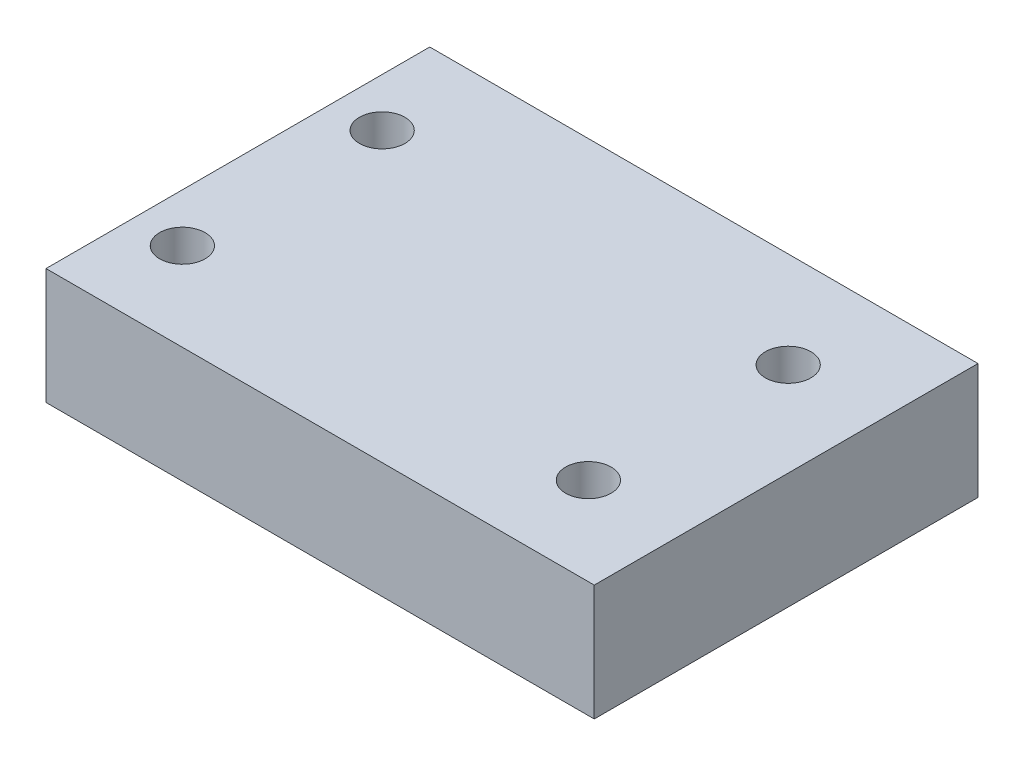
ISO-10303-21;
HEADER;
FILE_DESCRIPTION(('STEP AP214'),'2;1');
FILE_NAME('part.step','',(''),(''),'','','');
FILE_SCHEMA(('AUTOMOTIVE_DESIGN { 1 0 10303 214 1 1 1 1 }'));
ENDSEC;
DATA;
#1=APPLICATION_CONTEXT('core data for automotive mechanical design processes');
#2=APPLICATION_PROTOCOL_DEFINITION('international standard','automotive_design',2000,#1);
#3=PRODUCT_CONTEXT('',#1,'mechanical');
#4=PRODUCT('Part','Part','',(#3));
#5=PRODUCT_RELATED_PRODUCT_CATEGORY('part','',(#4));
#6=PRODUCT_DEFINITION_FORMATION('','',#4);
#7=PRODUCT_DEFINITION_CONTEXT('part definition',#1,'design');
#8=PRODUCT_DEFINITION('design','',#6,#7);
#9=PRODUCT_DEFINITION_SHAPE('','',#8);
#10=(LENGTH_UNIT() NAMED_UNIT(*) SI_UNIT(.MILLI.,.METRE.));
#11=(NAMED_UNIT(*) PLANE_ANGLE_UNIT() SI_UNIT($,.RADIAN.));
#12=(NAMED_UNIT(*) SI_UNIT($,.STERADIAN.) SOLID_ANGLE_UNIT());
#13=UNCERTAINTY_MEASURE_WITH_UNIT(LENGTH_MEASURE(1.E-05),#10,'distance_accuracy_value','');
#14=(GEOMETRIC_REPRESENTATION_CONTEXT(3) GLOBAL_UNCERTAINTY_ASSIGNED_CONTEXT((#13)) GLOBAL_UNIT_ASSIGNED_CONTEXT((#10,
#11,#12)) REPRESENTATION_CONTEXT('',''));
#15=CARTESIAN_POINT('',(0.,0.,0.));
#16=DIRECTION('',(0.,0.,1.));
#17=DIRECTION('',(1.,0.,0.));
#18=AXIS2_PLACEMENT_3D('',#15,#16,#17);
#19=CARTESIAN_POINT('',(30.0101,12.7,-21.0058));
#20=DIRECTION('',(-1.,0.,0.));
#21=DIRECTION('',(0.,0.,1.));
#22=AXIS2_PLACEMENT_3D('',#19,#20,#21);
#23=PLANE('',#22);
#24=DIRECTION('',(0.,0.,-1.));
#25=VECTOR('',#24,1.);
#26=CARTESIAN_POINT('',(30.0101,0.,-21.0058));
#27=LINE('',#26,#25);
#28=CARTESIAN_POINT('',(30.0101,0.,21.0058));
#29=VERTEX_POINT('',#28);
#30=CARTESIAN_POINT('',(30.0101,0.,-21.0058));
#31=VERTEX_POINT('',#30);
#32=EDGE_CURVE('E110',#29,#31,#27,.T.);
#33=ORIENTED_EDGE('',*,*,#32,.T.);
#34=DIRECTION('',(0.,-1.,0.));
#35=VECTOR('',#34,1.);
#36=CARTESIAN_POINT('',(30.0101,12.7,-21.0058));
#37=LINE('',#36,#35);
#38=CARTESIAN_POINT('',(30.0101,12.7,-21.0058));
#39=VERTEX_POINT('',#38);
#40=EDGE_CURVE('E11',#39,#31,#37,.T.);
#41=ORIENTED_EDGE('',*,*,#40,.F.);
#42=DIRECTION('',(0.,0.,-1.));
#43=VECTOR('',#42,1.);
#44=CARTESIAN_POINT('',(30.0101,12.7,-21.0058));
#45=LINE('',#44,#43);
#46=CARTESIAN_POINT('',(30.0101,12.7,21.0058));
#47=VERTEX_POINT('',#46);
#48=EDGE_CURVE('E94',#47,#39,#45,.T.);
#49=ORIENTED_EDGE('',*,*,#48,.F.);
#50=DIRECTION('',(0.,-1.,0.));
#51=VECTOR('',#50,1.);
#52=CARTESIAN_POINT('',(30.0101,12.7,21.0058));
#53=LINE('',#52,#51);
#54=EDGE_CURVE('E106',#47,#29,#53,.T.);
#55=ORIENTED_EDGE('',*,*,#54,.T.);
#56=EDGE_LOOP('',(#33,#41,#49,#55));
#57=FACE_BOUND('',#56,.T.);
#58=ADVANCED_FACE('F42',(#57),#23,.F.);
#59=CARTESIAN_POINT('',(-30.0101,12.7,-21.0058));
#60=DIRECTION('',(0.,0.,1.));
#61=DIRECTION('',(1.,0.,0.));
#62=AXIS2_PLACEMENT_3D('',#59,#60,#61);
#63=PLANE('',#62);
#64=DIRECTION('',(-1.,0.,0.));
#65=VECTOR('',#64,1.);
#66=CARTESIAN_POINT('',(-30.0101,0.,-21.0058));
#67=LINE('',#66,#65);
#68=CARTESIAN_POINT('',(-30.0101,0.,-21.0058));
#69=VERTEX_POINT('',#68);
#70=EDGE_CURVE('E99',#31,#69,#67,.T.);
#71=ORIENTED_EDGE('',*,*,#70,.T.);
#72=DIRECTION('',(0.,-1.,0.));
#73=VECTOR('',#72,1.);
#74=CARTESIAN_POINT('',(-30.0101,12.7,-21.0058));
#75=LINE('',#74,#73);
#76=CARTESIAN_POINT('',(-30.0101,12.7,-21.0058));
#77=VERTEX_POINT('',#76);
#78=EDGE_CURVE('E51',#77,#69,#75,.T.);
#79=ORIENTED_EDGE('',*,*,#78,.F.);
#80=DIRECTION('',(-1.,0.,0.));
#81=VECTOR('',#80,1.);
#82=CARTESIAN_POINT('',(-30.0101,12.7,-21.0058));
#83=LINE('',#82,#81);
#84=EDGE_CURVE('E89',#39,#77,#83,.T.);
#85=ORIENTED_EDGE('',*,*,#84,.F.);
#86=ORIENTED_EDGE('',*,*,#40,.T.);
#87=EDGE_LOOP('',(#71,#79,#85,#86));
#88=FACE_BOUND('',#87,.T.);
#89=ADVANCED_FACE('F98',(#88),#63,.F.);
#90=CARTESIAN_POINT('',(-30.0101,12.7,-21.0058));
#91=DIRECTION('',(1.,0.,0.));
#92=DIRECTION('',(0.,0.,-1.));
#93=AXIS2_PLACEMENT_3D('',#90,#91,#92);
#94=PLANE('',#93);
#95=DIRECTION('',(0.,0.,1.));
#96=VECTOR('',#95,1.);
#97=CARTESIAN_POINT('',(-30.0101,0.,-21.0058));
#98=LINE('',#97,#96);
#99=CARTESIAN_POINT('',(-30.0101,0.,21.0058));
#100=VERTEX_POINT('',#99);
#101=EDGE_CURVE('E76',#69,#100,#98,.T.);
#102=ORIENTED_EDGE('',*,*,#101,.T.);
#103=DIRECTION('',(0.,-1.,0.));
#104=VECTOR('',#103,1.);
#105=CARTESIAN_POINT('',(-30.0101,12.7,21.0058));
#106=LINE('',#105,#104);
#107=CARTESIAN_POINT('',(-30.0101,12.7,21.0058));
#108=VERTEX_POINT('',#107);
#109=EDGE_CURVE('E101',#108,#100,#106,.T.);
#110=ORIENTED_EDGE('',*,*,#109,.F.);
#111=DIRECTION('',(0.,0.,1.));
#112=VECTOR('',#111,1.);
#113=CARTESIAN_POINT('',(-30.0101,12.7,-21.0058));
#114=LINE('',#113,#112);
#115=EDGE_CURVE('E92',#77,#108,#114,.T.);
#116=ORIENTED_EDGE('',*,*,#115,.F.);
#117=ORIENTED_EDGE('',*,*,#78,.T.);
#118=EDGE_LOOP('',(#102,#110,#116,#117));
#119=FACE_BOUND('',#118,.T.);
#120=ADVANCED_FACE('F102',(#119),#94,.F.);
#121=CARTESIAN_POINT('',(-30.0101,12.7,21.0058));
#122=DIRECTION('',(0.,0.,-1.));
#123=DIRECTION('',(-1.,0.,0.));
#124=AXIS2_PLACEMENT_3D('',#121,#122,#123);
#125=PLANE('',#124);
#126=DIRECTION('',(1.,0.,0.));
#127=VECTOR('',#126,1.);
#128=CARTESIAN_POINT('',(-30.0101,0.,21.0058));
#129=LINE('',#128,#127);
#130=EDGE_CURVE('E82',#100,#29,#129,.T.);
#131=ORIENTED_EDGE('',*,*,#130,.T.);
#132=ORIENTED_EDGE('',*,*,#54,.F.);
#133=DIRECTION('',(1.,0.,0.));
#134=VECTOR('',#133,1.);
#135=CARTESIAN_POINT('',(-30.0101,12.7,21.0058));
#136=LINE('',#135,#134);
#137=EDGE_CURVE('E59',#108,#47,#136,.T.);
#138=ORIENTED_EDGE('',*,*,#137,.F.);
#139=ORIENTED_EDGE('',*,*,#109,.T.);
#140=EDGE_LOOP('',(#131,#132,#138,#139));
#141=FACE_BOUND('',#140,.T.);
#142=ADVANCED_FACE('F124',(#141),#125,.F.);
#143=CARTESIAN_POINT('',(0.,12.7,0.));
#144=DIRECTION('',(0.,1.,0.));
#145=DIRECTION('',(0.,0.,1.));
#146=AXIS2_PLACEMENT_3D('',#143,#144,#145);
#147=PLANE('',#146);
#148=CARTESIAN_POINT('',(-24.7101106,12.7,-10.494772));
#149=DIRECTION('',(0.,1.,0.));
#150=DIRECTION('',(0.,0.,1.));
#151=AXIS2_PLACEMENT_3D('',#148,#149,#150);
#152=CIRCLE('',#151,2.48919999999999);
#153=CARTESIAN_POINT('',(-24.7101106,12.7,-8.00557200000001));
#154=VERTEX_POINT('',#153);
#155=EDGE_CURVE('E158',#154,#154,#152,.T.);
#156=ORIENTED_EDGE('',*,*,#155,.F.);
#157=EDGE_LOOP('',(#156));
#158=FACE_BOUND('',#157,.T.);
#159=CARTESIAN_POINT('',(-24.7101106,12.7,11.3792));
#160=DIRECTION('',(0.,1.,0.));
#161=DIRECTION('',(0.,0.,1.));
#162=AXIS2_PLACEMENT_3D('',#159,#160,#161);
#163=CIRCLE('',#162,2.48919999999999);
#164=CARTESIAN_POINT('',(-24.7101106,12.7,13.8684));
#165=VERTEX_POINT('',#164);
#166=EDGE_CURVE('E150',#165,#165,#163,.T.);
#167=ORIENTED_EDGE('',*,*,#166,.F.);
#168=EDGE_LOOP('',(#167));
#169=FACE_BOUND('',#168,.T.);
#170=CARTESIAN_POINT('',(19.7398894,12.7,11.3792));
#171=DIRECTION('',(0.,1.,0.));
#172=DIRECTION('',(0.,0.,1.));
#173=AXIS2_PLACEMENT_3D('',#170,#171,#172);
#174=CIRCLE('',#173,2.48919999999999);
#175=CARTESIAN_POINT('',(19.7398894,12.7,13.8684));
#176=VERTEX_POINT('',#175);
#177=EDGE_CURVE('E142',#176,#176,#174,.T.);
#178=ORIENTED_EDGE('',*,*,#177,.F.);
#179=EDGE_LOOP('',(#178));
#180=FACE_BOUND('',#179,.T.);
#181=CARTESIAN_POINT('',(19.7398894,12.7,-10.494772));
#182=DIRECTION('',(0.,1.,0.));
#183=DIRECTION('',(0.,0.,1.));
#184=AXIS2_PLACEMENT_3D('',#181,#182,#183);
#185=CIRCLE('',#184,2.48919999999999);
#186=CARTESIAN_POINT('',(19.7398894,12.7,-8.00557200000001));
#187=VERTEX_POINT('',#186);
#188=EDGE_CURVE('E134',#187,#187,#185,.T.);
#189=ORIENTED_EDGE('',*,*,#188,.F.);
#190=EDGE_LOOP('',(#189));
#191=FACE_BOUND('',#190,.T.);
#192=ORIENTED_EDGE('',*,*,#48,.T.);
#193=ORIENTED_EDGE('',*,*,#84,.T.);
#194=ORIENTED_EDGE('',*,*,#115,.T.);
#195=ORIENTED_EDGE('',*,*,#137,.T.);
#196=EDGE_LOOP('',(#192,#193,#194,#195));
#197=FACE_BOUND('',#196,.T.);
#198=ADVANCED_FACE('F90',(#158,#169,#180,#191,#197),#147,.T.);
#199=CARTESIAN_POINT('',(0.,0.,0.));
#200=DIRECTION('',(0.,1.,0.));
#201=DIRECTION('',(0.,0.,1.));
#202=AXIS2_PLACEMENT_3D('',#199,#200,#201);
#203=PLANE('',#202);
#204=CARTESIAN_POINT('',(-24.7101106,0.,-10.494772));
#205=DIRECTION('',(0.,1.,0.));
#206=DIRECTION('',(0.,0.,1.));
#207=AXIS2_PLACEMENT_3D('',#204,#205,#206);
#208=CIRCLE('',#207,2.48919999999999);
#209=CARTESIAN_POINT('',(-24.7101106,0.,-8.005572));
#210=VERTEX_POINT('',#209);
#211=EDGE_CURVE('E154',#210,#210,#208,.T.);
#212=ORIENTED_EDGE('',*,*,#211,.T.);
#213=EDGE_LOOP('',(#212));
#214=FACE_BOUND('',#213,.T.);
#215=CARTESIAN_POINT('',(-24.7101106,0.,11.3792));
#216=DIRECTION('',(0.,1.,0.));
#217=DIRECTION('',(0.,0.,1.));
#218=AXIS2_PLACEMENT_3D('',#215,#216,#217);
#219=CIRCLE('',#218,2.48919999999999);
#220=CARTESIAN_POINT('',(-24.7101106,0.,13.8684));
#221=VERTEX_POINT('',#220);
#222=EDGE_CURVE('E146',#221,#221,#219,.T.);
#223=ORIENTED_EDGE('',*,*,#222,.T.);
#224=EDGE_LOOP('',(#223));
#225=FACE_BOUND('',#224,.T.);
#226=CARTESIAN_POINT('',(19.7398894,0.,11.3792));
#227=DIRECTION('',(0.,1.,0.));
#228=DIRECTION('',(0.,0.,1.));
#229=AXIS2_PLACEMENT_3D('',#226,#227,#228);
#230=CIRCLE('',#229,2.48919999999999);
#231=CARTESIAN_POINT('',(19.7398894,0.,13.8684));
#232=VERTEX_POINT('',#231);
#233=EDGE_CURVE('E138',#232,#232,#230,.T.);
#234=ORIENTED_EDGE('',*,*,#233,.T.);
#235=EDGE_LOOP('',(#234));
#236=FACE_BOUND('',#235,.T.);
#237=CARTESIAN_POINT('',(19.7398894,0.,-10.494772));
#238=DIRECTION('',(0.,1.,0.));
#239=DIRECTION('',(0.,0.,1.));
#240=AXIS2_PLACEMENT_3D('',#237,#238,#239);
#241=CIRCLE('',#240,2.48919999999999);
#242=CARTESIAN_POINT('',(19.7398894,0.,-8.005572));
#243=VERTEX_POINT('',#242);
#244=EDGE_CURVE('E114',#243,#243,#241,.T.);
#245=ORIENTED_EDGE('',*,*,#244,.T.);
#246=EDGE_LOOP('',(#245));
#247=FACE_BOUND('',#246,.T.);
#248=ORIENTED_EDGE('',*,*,#32,.F.);
#249=ORIENTED_EDGE('',*,*,#130,.F.);
#250=ORIENTED_EDGE('',*,*,#101,.F.);
#251=ORIENTED_EDGE('',*,*,#70,.F.);
#252=EDGE_LOOP('',(#248,#249,#250,#251));
#253=FACE_BOUND('',#252,.T.);
#254=ADVANCED_FACE('F127',(#214,#225,#236,#247,#253),#203,.F.);
#255=CARTESIAN_POINT('',(19.7398894,12.7,-10.494772));
#256=DIRECTION('',(0.,1.,0.));
#257=DIRECTION('',(0.,0.,1.));
#258=AXIS2_PLACEMENT_3D('',#255,#256,#257);
#259=CYLINDRICAL_SURFACE('',#258,2.48919999999999);
#260=ORIENTED_EDGE('',*,*,#244,.F.);
#261=EDGE_LOOP('',(#260));
#262=FACE_BOUND('',#261,.T.);
#263=ORIENTED_EDGE('',*,*,#188,.T.);
#264=EDGE_LOOP('',(#263));
#265=FACE_BOUND('',#264,.T.);
#266=ADVANCED_FACE('F174',(#262,#265),#259,.F.);
#267=CARTESIAN_POINT('',(19.7398894,12.7,11.3792));
#268=DIRECTION('',(0.,1.,0.));
#269=DIRECTION('',(0.,0.,1.));
#270=AXIS2_PLACEMENT_3D('',#267,#268,#269);
#271=CYLINDRICAL_SURFACE('',#270,2.48919999999999);
#272=ORIENTED_EDGE('',*,*,#233,.F.);
#273=EDGE_LOOP('',(#272));
#274=FACE_BOUND('',#273,.T.);
#275=ORIENTED_EDGE('',*,*,#177,.T.);
#276=EDGE_LOOP('',(#275));
#277=FACE_BOUND('',#276,.T.);
#278=ADVANCED_FACE('F176',(#274,#277),#271,.F.);
#279=CARTESIAN_POINT('',(-24.7101106,12.7,11.3792));
#280=DIRECTION('',(0.,1.,0.));
#281=DIRECTION('',(0.,0.,1.));
#282=AXIS2_PLACEMENT_3D('',#279,#280,#281);
#283=CYLINDRICAL_SURFACE('',#282,2.48919999999999);
#284=ORIENTED_EDGE('',*,*,#222,.F.);
#285=EDGE_LOOP('',(#284));
#286=FACE_BOUND('',#285,.T.);
#287=ORIENTED_EDGE('',*,*,#166,.T.);
#288=EDGE_LOOP('',(#287));
#289=FACE_BOUND('',#288,.T.);
#290=ADVANCED_FACE('F183',(#286,#289),#283,.F.);
#291=CARTESIAN_POINT('',(-24.7101106,12.7,-10.494772));
#292=DIRECTION('',(0.,1.,0.));
#293=DIRECTION('',(0.,0.,1.));
#294=AXIS2_PLACEMENT_3D('',#291,#292,#293);
#295=CYLINDRICAL_SURFACE('',#294,2.48919999999999);
#296=ORIENTED_EDGE('',*,*,#211,.F.);
#297=EDGE_LOOP('',(#296));
#298=FACE_BOUND('',#297,.T.);
#299=ORIENTED_EDGE('',*,*,#155,.T.);
#300=EDGE_LOOP('',(#299));
#301=FACE_BOUND('',#300,.T.);
#302=ADVANCED_FACE('F163',(#298,#301),#295,.F.);
#303=CLOSED_SHELL('',(#58,#89,#120,#142,#198,#254,#266,#278,#290,#302));
#304=MANIFOLD_SOLID_BREP('B2',#303);
#305=ADVANCED_BREP_SHAPE_REPRESENTATION('',(#18,#304),#14);
#306=SHAPE_DEFINITION_REPRESENTATION(#9,#305);
ENDSEC;
END-ISO-10303-21;
